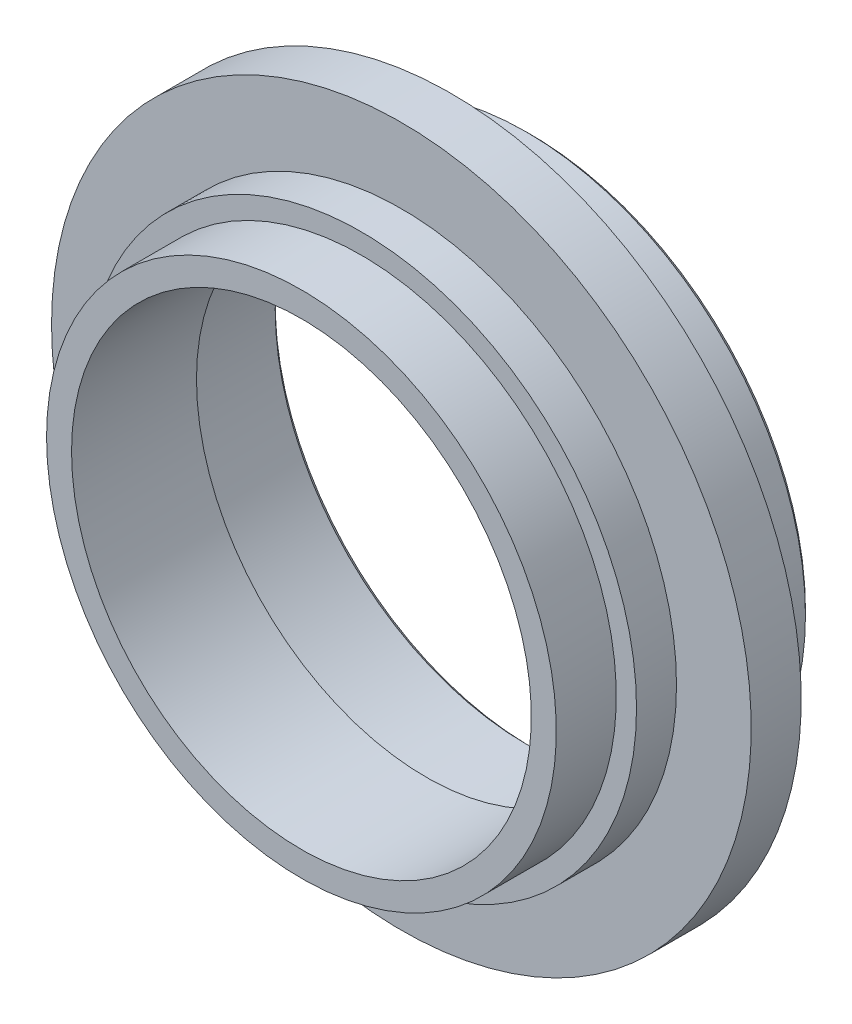
ISO-10303-21;
HEADER;
FILE_DESCRIPTION(('STEP AP214'),'2;1');
FILE_NAME('part.step','',(''),(''),'','','');
FILE_SCHEMA(('AUTOMOTIVE_DESIGN { 1 0 10303 214 1 1 1 1 }'));
ENDSEC;
DATA;
#1=APPLICATION_CONTEXT('core data for automotive mechanical design processes');
#2=APPLICATION_PROTOCOL_DEFINITION('international standard','automotive_design',2000,#1);
#3=PRODUCT_CONTEXT('',#1,'mechanical');
#4=PRODUCT('Part','Part','',(#3));
#5=PRODUCT_RELATED_PRODUCT_CATEGORY('part','',(#4));
#6=PRODUCT_DEFINITION_FORMATION('','',#4);
#7=PRODUCT_DEFINITION_CONTEXT('part definition',#1,'design');
#8=PRODUCT_DEFINITION('design','',#6,#7);
#9=PRODUCT_DEFINITION_SHAPE('','',#8);
#10=(LENGTH_UNIT() NAMED_UNIT(*) SI_UNIT(.MILLI.,.METRE.));
#11=(NAMED_UNIT(*) PLANE_ANGLE_UNIT() SI_UNIT($,.RADIAN.));
#12=(NAMED_UNIT(*) SI_UNIT($,.STERADIAN.) SOLID_ANGLE_UNIT());
#13=UNCERTAINTY_MEASURE_WITH_UNIT(LENGTH_MEASURE(1.E-05),#10,'distance_accuracy_value','');
#14=(GEOMETRIC_REPRESENTATION_CONTEXT(3) GLOBAL_UNCERTAINTY_ASSIGNED_CONTEXT((#13)) GLOBAL_UNIT_ASSIGNED_CONTEXT((#10,
#11,#12)) REPRESENTATION_CONTEXT('',''));
#15=CARTESIAN_POINT('',(0.,0.,0.));
#16=DIRECTION('',(0.,0.,1.));
#17=DIRECTION('',(1.,0.,0.));
#18=AXIS2_PLACEMENT_3D('',#15,#16,#17);
#19=CARTESIAN_POINT('',(0.,0.,-99.29791666667));
#20=DIRECTION('',(0.,0.,-1.));
#21=DIRECTION('',(-1.,0.,0.));
#22=AXIS2_PLACEMENT_3D('',#19,#20,#21);
#23=CYLINDRICAL_SURFACE('',#22,25.5);
#24=CARTESIAN_POINT('',(0.,0.,-6.00000000000002));
#25=DIRECTION('',(0.,0.,-1.));
#26=DIRECTION('',(-1.,0.,0.));
#27=AXIS2_PLACEMENT_3D('',#24,#25,#26);
#28=CIRCLE('',#27,25.5);
#29=CARTESIAN_POINT('',(-25.5,0.,-6.00000000000002));
#30=VERTEX_POINT('',#29);
#31=EDGE_CURVE('E83',#30,#30,#28,.T.);
#32=ORIENTED_EDGE('',*,*,#31,.F.);
#33=EDGE_LOOP('',(#32));
#34=FACE_BOUND('',#33,.T.);
#35=CARTESIAN_POINT('',(0.,0.,0.));
#36=DIRECTION('',(0.,0.,-1.));
#37=DIRECTION('',(-1.,0.,0.));
#38=AXIS2_PLACEMENT_3D('',#35,#36,#37);
#39=CIRCLE('',#38,25.5);
#40=CARTESIAN_POINT('',(-25.5,0.,0.));
#41=VERTEX_POINT('',#40);
#42=EDGE_CURVE('E56',#41,#41,#39,.T.);
#43=ORIENTED_EDGE('',*,*,#42,.T.);
#44=EDGE_LOOP('',(#43));
#45=FACE_BOUND('',#44,.T.);
#46=ADVANCED_FACE('F36',(#34,#45),#23,.T.);
#47=CARTESIAN_POINT('',(25.5,0.,0.));
#48=DIRECTION('',(0.,0.,-1.));
#49=DIRECTION('',(-1.,0.,0.));
#50=AXIS2_PLACEMENT_3D('',#47,#48,#49);
#51=PLANE('',#50);
#52=ORIENTED_EDGE('',*,*,#42,.F.);
#53=EDGE_LOOP('',(#52));
#54=FACE_BOUND('',#53,.T.);
#55=CARTESIAN_POINT('',(0.,0.,0.));
#56=DIRECTION('',(0.,0.,-1.));
#57=DIRECTION('',(-1.,0.,0.));
#58=AXIS2_PLACEMENT_3D('',#55,#56,#57);
#59=CIRCLE('',#58,23.);
#60=CARTESIAN_POINT('',(-23.,0.,0.));
#61=VERTEX_POINT('',#60);
#62=EDGE_CURVE('E59',#61,#61,#59,.T.);
#63=ORIENTED_EDGE('',*,*,#62,.T.);
#64=EDGE_LOOP('',(#63));
#65=FACE_BOUND('',#64,.T.);
#66=ADVANCED_FACE('F91',(#54,#65),#51,.F.);
#67=CARTESIAN_POINT('',(0.,0.,-99.29791666667));
#68=DIRECTION('',(0.,0.,-1.));
#69=DIRECTION('',(-1.,0.,0.));
#70=AXIS2_PLACEMENT_3D('',#67,#68,#69);
#71=CYLINDRICAL_SURFACE('',#70,23.);
#72=ORIENTED_EDGE('',*,*,#62,.F.);
#73=EDGE_LOOP('',(#72));
#74=FACE_BOUND('',#73,.T.);
#75=CARTESIAN_POINT('',(0.,0.,-12.5));
#76=DIRECTION('',(0.,0.,-1.));
#77=DIRECTION('',(-1.,0.,0.));
#78=AXIS2_PLACEMENT_3D('',#75,#76,#77);
#79=CIRCLE('',#78,23.);
#80=CARTESIAN_POINT('',(-23.,0.,-12.5));
#81=VERTEX_POINT('',#80);
#82=EDGE_CURVE('E62',#81,#81,#79,.T.);
#83=ORIENTED_EDGE('',*,*,#82,.T.);
#84=EDGE_LOOP('',(#83));
#85=FACE_BOUND('',#84,.T.);
#86=ADVANCED_FACE('F97',(#74,#85),#71,.F.);
#87=CARTESIAN_POINT('',(25.125,0.,-12.5));
#88=DIRECTION('',(0.,0.,1.));
#89=DIRECTION('',(1.,0.,0.));
#90=AXIS2_PLACEMENT_3D('',#87,#88,#89);
#91=PLANE('',#90);
#92=ORIENTED_EDGE('',*,*,#82,.F.);
#93=EDGE_LOOP('',(#92));
#94=FACE_BOUND('',#93,.T.);
#95=CARTESIAN_POINT('',(0.,0.,-12.5));
#96=DIRECTION('',(0.,0.,-1.));
#97=DIRECTION('',(-1.,0.,0.));
#98=AXIS2_PLACEMENT_3D('',#95,#96,#97);
#99=CIRCLE('',#98,25.125);
#100=CARTESIAN_POINT('',(-25.125,0.,-12.5));
#101=VERTEX_POINT('',#100);
#102=EDGE_CURVE('E65',#101,#101,#99,.T.);
#103=ORIENTED_EDGE('',*,*,#102,.T.);
#104=EDGE_LOOP('',(#103));
#105=FACE_BOUND('',#104,.T.);
#106=ADVANCED_FACE('F103',(#94,#105),#91,.F.);
#107=CARTESIAN_POINT('',(0.,0.,-99.29791666667));
#108=DIRECTION('',(0.,0.,-1.));
#109=DIRECTION('',(-1.,0.,0.));
#110=AXIS2_PLACEMENT_3D('',#107,#108,#109);
#111=CYLINDRICAL_SURFACE('',#110,25.125);
#112=CARTESIAN_POINT('',(0.,0.,-22.5));
#113=DIRECTION('',(0.,0.,1.));
#114=DIRECTION('',(1.,0.,0.));
#115=AXIS2_PLACEMENT_3D('',#112,#113,#114);
#116=CIRCLE('',#115,25.125);
#117=CARTESIAN_POINT('',(25.125,0.,-22.5));
#118=VERTEX_POINT('',#117);
#119=EDGE_CURVE('E10',#118,#118,#116,.F.);
#120=ORIENTED_EDGE('',*,*,#119,.T.);
#121=EDGE_LOOP('',(#120));
#122=FACE_BOUND('',#121,.T.);
#123=ORIENTED_EDGE('',*,*,#102,.F.);
#124=EDGE_LOOP('',(#123));
#125=FACE_BOUND('',#124,.T.);
#126=ADVANCED_FACE('F109',(#122,#125),#111,.F.);
#127=CARTESIAN_POINT('',(25.125,0.,-23.));
#128=DIRECTION('',(0.,0.,1.));
#129=DIRECTION('',(1.,0.,0.));
#130=AXIS2_PLACEMENT_3D('',#127,#128,#129);
#131=PLANE('',#130);
#132=CARTESIAN_POINT('',(0.,0.,-23.));
#133=DIRECTION('',(0.,0.,1.));
#134=DIRECTION('',(1.,0.,0.));
#135=AXIS2_PLACEMENT_3D('',#132,#133,#134);
#136=CIRCLE('',#135,27.425);
#137=CARTESIAN_POINT('',(27.425,0.,-23.));
#138=VERTEX_POINT('',#137);
#139=EDGE_CURVE('E47',#138,#138,#136,.F.);
#140=ORIENTED_EDGE('',*,*,#139,.T.);
#141=EDGE_LOOP('',(#140));
#142=FACE_BOUND('',#141,.T.);
#143=CARTESIAN_POINT('',(0.,0.,-23.));
#144=DIRECTION('',(0.,0.,1.));
#145=DIRECTION('',(1.,0.,0.));
#146=AXIS2_PLACEMENT_3D('',#143,#144,#145);
#147=CIRCLE('',#146,25.625);
#148=CARTESIAN_POINT('',(25.625,0.,-23.));
#149=VERTEX_POINT('',#148);
#150=EDGE_CURVE('E51',#149,#149,#147,.T.);
#151=ORIENTED_EDGE('',*,*,#150,.T.);
#152=EDGE_LOOP('',(#151));
#153=FACE_BOUND('',#152,.T.);
#154=ADVANCED_FACE('F114',(#142,#153),#131,.F.);
#155=CARTESIAN_POINT('',(0.,0.,-99.29791666667));
#156=DIRECTION('',(0.,0.,-1.));
#157=DIRECTION('',(-1.,0.,0.));
#158=AXIS2_PLACEMENT_3D('',#155,#156,#157);
#159=CYLINDRICAL_SURFACE('',#158,27.925);
#160=CARTESIAN_POINT('',(0.,0.,-22.5));
#161=DIRECTION('',(0.,0.,1.));
#162=DIRECTION('',(1.,0.,0.));
#163=AXIS2_PLACEMENT_3D('',#160,#161,#162);
#164=CIRCLE('',#163,27.925);
#165=CARTESIAN_POINT('',(27.925,0.,-22.5));
#166=VERTEX_POINT('',#165);
#167=EDGE_CURVE('E43',#166,#166,#164,.T.);
#168=ORIENTED_EDGE('',*,*,#167,.T.);
#169=EDGE_LOOP('',(#168));
#170=FACE_BOUND('',#169,.T.);
#171=CARTESIAN_POINT('',(0.,0.,-15.));
#172=DIRECTION('',(0.,0.,-1.));
#173=DIRECTION('',(-1.,0.,0.));
#174=AXIS2_PLACEMENT_3D('',#171,#172,#173);
#175=CIRCLE('',#174,27.925);
#176=CARTESIAN_POINT('',(-27.925,0.,-15.));
#177=VERTEX_POINT('',#176);
#178=EDGE_CURVE('E68',#177,#177,#175,.T.);
#179=ORIENTED_EDGE('',*,*,#178,.T.);
#180=EDGE_LOOP('',(#179));
#181=FACE_BOUND('',#180,.T.);
#182=ADVANCED_FACE('F119',(#170,#181),#159,.T.);
#183=CARTESIAN_POINT('',(27.925,0.,-15.));
#184=DIRECTION('',(0.,0.,1.));
#185=DIRECTION('',(1.,0.,0.));
#186=AXIS2_PLACEMENT_3D('',#183,#184,#185);
#187=PLANE('',#186);
#188=ORIENTED_EDGE('',*,*,#178,.F.);
#189=EDGE_LOOP('',(#188));
#190=FACE_BOUND('',#189,.T.);
#191=CARTESIAN_POINT('',(0.,0.,-15.));
#192=DIRECTION('',(0.,0.,-1.));
#193=DIRECTION('',(-1.,0.,0.));
#194=AXIS2_PLACEMENT_3D('',#191,#192,#193);
#195=CIRCLE('',#194,35.);
#196=CARTESIAN_POINT('',(-35.,0.,-15.));
#197=VERTEX_POINT('',#196);
#198=EDGE_CURVE('E71',#197,#197,#195,.T.);
#199=ORIENTED_EDGE('',*,*,#198,.T.);
#200=EDGE_LOOP('',(#199));
#201=FACE_BOUND('',#200,.T.);
#202=ADVANCED_FACE('F153',(#190,#201),#187,.F.);
#203=CARTESIAN_POINT('',(0.,0.,-99.29791666667));
#204=DIRECTION('',(0.,0.,-1.));
#205=DIRECTION('',(-1.,0.,0.));
#206=AXIS2_PLACEMENT_3D('',#203,#204,#205);
#207=CYLINDRICAL_SURFACE('',#206,35.);
#208=ORIENTED_EDGE('',*,*,#198,.F.);
#209=EDGE_LOOP('',(#208));
#210=FACE_BOUND('',#209,.T.);
#211=CARTESIAN_POINT('',(0.,0.,-9.99999999999999));
#212=DIRECTION('',(0.,0.,-1.));
#213=DIRECTION('',(-1.,0.,0.));
#214=AXIS2_PLACEMENT_3D('',#211,#212,#213);
#215=CIRCLE('',#214,35.);
#216=CARTESIAN_POINT('',(-35.,0.,-9.99999999999999));
#217=VERTEX_POINT('',#216);
#218=EDGE_CURVE('E74',#217,#217,#215,.T.);
#219=ORIENTED_EDGE('',*,*,#218,.T.);
#220=EDGE_LOOP('',(#219));
#221=FACE_BOUND('',#220,.T.);
#222=ADVANCED_FACE('F149',(#210,#221),#207,.T.);
#223=CARTESIAN_POINT('',(35.,0.,-10.));
#224=DIRECTION('',(0.,0.,-1.));
#225=DIRECTION('',(-1.,0.,0.));
#226=AXIS2_PLACEMENT_3D('',#223,#224,#225);
#227=PLANE('',#226);
#228=ORIENTED_EDGE('',*,*,#218,.F.);
#229=EDGE_LOOP('',(#228));
#230=FACE_BOUND('',#229,.T.);
#231=CARTESIAN_POINT('',(0.,0.,-9.99999999999999));
#232=DIRECTION('',(0.,0.,-1.));
#233=DIRECTION('',(-1.,0.,0.));
#234=AXIS2_PLACEMENT_3D('',#231,#232,#233);
#235=CIRCLE('',#234,27.525);
#236=CARTESIAN_POINT('',(-27.525,0.,-9.99999999999999));
#237=VERTEX_POINT('',#236);
#238=EDGE_CURVE('E77',#237,#237,#235,.T.);
#239=ORIENTED_EDGE('',*,*,#238,.T.);
#240=EDGE_LOOP('',(#239));
#241=FACE_BOUND('',#240,.T.);
#242=ADVANCED_FACE('F142',(#230,#241),#227,.F.);
#243=CARTESIAN_POINT('',(0.,0.,-99.29791666667));
#244=DIRECTION('',(0.,0.,-1.));
#245=DIRECTION('',(-1.,0.,0.));
#246=AXIS2_PLACEMENT_3D('',#243,#244,#245);
#247=CYLINDRICAL_SURFACE('',#246,27.525);
#248=ORIENTED_EDGE('',*,*,#238,.F.);
#249=EDGE_LOOP('',(#248));
#250=FACE_BOUND('',#249,.T.);
#251=CARTESIAN_POINT('',(0.,0.,-6.00000000000002));
#252=DIRECTION('',(0.,0.,-1.));
#253=DIRECTION('',(-1.,0.,0.));
#254=AXIS2_PLACEMENT_3D('',#251,#252,#253);
#255=CIRCLE('',#254,27.525);
#256=CARTESIAN_POINT('',(-27.525,0.,-6.00000000000002));
#257=VERTEX_POINT('',#256);
#258=EDGE_CURVE('E80',#257,#257,#255,.T.);
#259=ORIENTED_EDGE('',*,*,#258,.T.);
#260=EDGE_LOOP('',(#259));
#261=FACE_BOUND('',#260,.T.);
#262=ADVANCED_FACE('F131',(#250,#261),#247,.T.);
#263=CARTESIAN_POINT('',(25.5,0.,-6.00000000000002));
#264=DIRECTION('',(0.,0.,-1.));
#265=DIRECTION('',(-1.,0.,0.));
#266=AXIS2_PLACEMENT_3D('',#263,#264,#265);
#267=PLANE('',#266);
#268=ORIENTED_EDGE('',*,*,#258,.F.);
#269=EDGE_LOOP('',(#268));
#270=FACE_BOUND('',#269,.T.);
#271=ORIENTED_EDGE('',*,*,#31,.T.);
#272=EDGE_LOOP('',(#271));
#273=FACE_BOUND('',#272,.T.);
#274=ADVANCED_FACE('F87',(#270,#273),#267,.F.);
#275=CARTESIAN_POINT('',(0.,0.,-23.));
#276=DIRECTION('',(0.,0.,1.));
#277=DIRECTION('',(1.,0.,0.));
#278=AXIS2_PLACEMENT_3D('',#275,#276,#277);
#279=CONICAL_SURFACE('',#278,27.425,0.785398163397445);
#280=ORIENTED_EDGE('',*,*,#167,.F.);
#281=EDGE_LOOP('',(#280));
#282=FACE_BOUND('',#281,.T.);
#283=ORIENTED_EDGE('',*,*,#139,.F.);
#284=EDGE_LOOP('',(#283));
#285=FACE_BOUND('',#284,.T.);
#286=ADVANCED_FACE('F123',(#282,#285),#279,.T.);
#287=CARTESIAN_POINT('',(0.,0.,-22.5));
#288=DIRECTION('',(0.,0.,-1.));
#289=DIRECTION('',(-1.,0.,0.));
#290=AXIS2_PLACEMENT_3D('',#287,#288,#289);
#291=CONICAL_SURFACE('',#290,25.125,0.785398163397452);
#292=ORIENTED_EDGE('',*,*,#150,.F.);
#293=EDGE_LOOP('',(#292));
#294=FACE_BOUND('',#293,.T.);
#295=ORIENTED_EDGE('',*,*,#119,.F.);
#296=EDGE_LOOP('',(#295));
#297=FACE_BOUND('',#296,.T.);
#298=ADVANCED_FACE('F38',(#294,#297),#291,.F.);
#299=CLOSED_SHELL('',(#46,#66,#86,#106,#126,#154,#182,#202,#222,#242,#262,#274,#286,#298));
#300=MANIFOLD_SOLID_BREP('B2',#299);
#301=ADVANCED_BREP_SHAPE_REPRESENTATION('',(#18,#300),#14);
#302=SHAPE_DEFINITION_REPRESENTATION(#9,#301);
ENDSEC;
END-ISO-10303-21;
